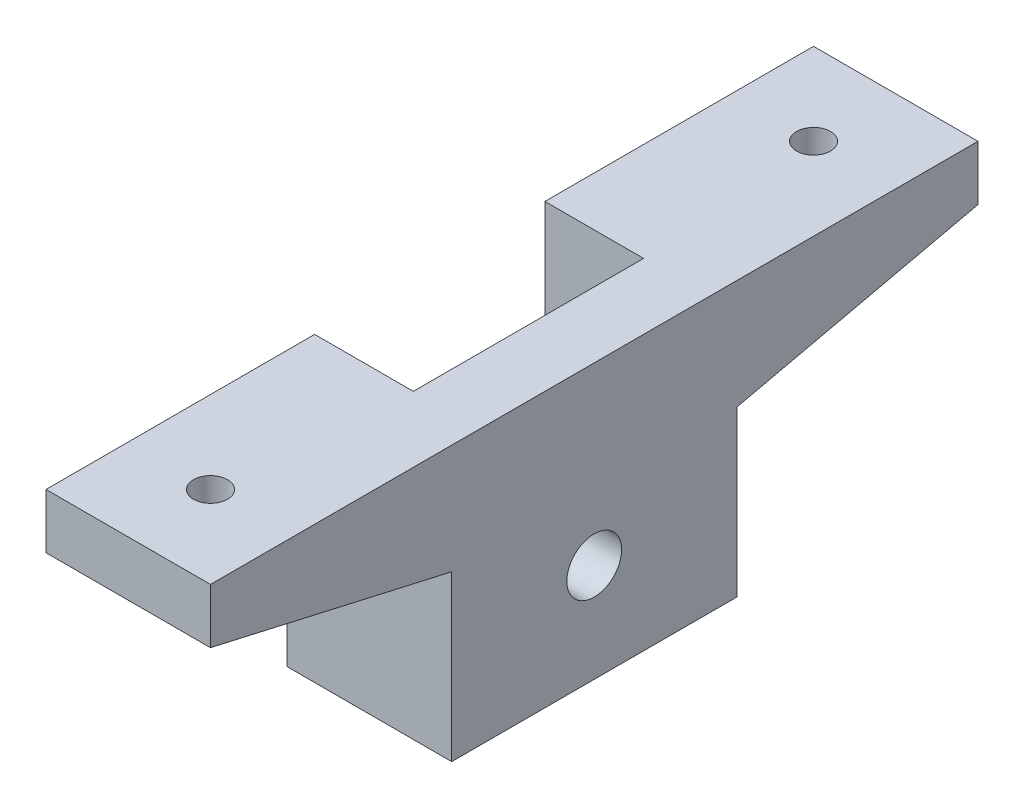
ISO-10303-21;
HEADER;
FILE_DESCRIPTION(('STEP AP214'),'2;1');
FILE_NAME('part.step','',(''),(''),'','','');
FILE_SCHEMA(('AUTOMOTIVE_DESIGN { 1 0 10303 214 1 1 1 1 }'));
ENDSEC;
DATA;
#1=APPLICATION_CONTEXT('core data for automotive mechanical design processes');
#2=APPLICATION_PROTOCOL_DEFINITION('international standard','automotive_design',2000,#1);
#3=PRODUCT_CONTEXT('',#1,'mechanical');
#4=PRODUCT('Part','Part','',(#3));
#5=PRODUCT_RELATED_PRODUCT_CATEGORY('part','',(#4));
#6=PRODUCT_DEFINITION_FORMATION('','',#4);
#7=PRODUCT_DEFINITION_CONTEXT('part definition',#1,'design');
#8=PRODUCT_DEFINITION('design','',#6,#7);
#9=PRODUCT_DEFINITION_SHAPE('','',#8);
#10=(LENGTH_UNIT() NAMED_UNIT(*) SI_UNIT(.MILLI.,.METRE.));
#11=(NAMED_UNIT(*) PLANE_ANGLE_UNIT() SI_UNIT($,.RADIAN.));
#12=(NAMED_UNIT(*) SI_UNIT($,.STERADIAN.) SOLID_ANGLE_UNIT());
#13=UNCERTAINTY_MEASURE_WITH_UNIT(LENGTH_MEASURE(1.E-05),#10,'distance_accuracy_value','');
#14=(GEOMETRIC_REPRESENTATION_CONTEXT(3) GLOBAL_UNCERTAINTY_ASSIGNED_CONTEXT((#13)) GLOBAL_UNIT_ASSIGNED_CONTEXT((#10,
#11,#12)) REPRESENTATION_CONTEXT('',''));
#15=CARTESIAN_POINT('',(0.,0.,0.));
#16=DIRECTION('',(0.,0.,1.));
#17=DIRECTION('',(1.,0.,0.));
#18=AXIS2_PLACEMENT_3D('',#15,#16,#17);
#19=CARTESIAN_POINT('',(0.,25.,70.));
#20=DIRECTION('',(1.,0.,0.));
#21=DIRECTION('',(0.,0.,-1.));
#22=AXIS2_PLACEMENT_3D('',#19,#20,#21);
#23=PLANE('',#22);
#24=DIRECTION('',(0.,0.,1.));
#25=VECTOR('',#24,1.);
#26=CARTESIAN_POINT('',(0.,0.,70.));
#27=LINE('',#26,#25);
#28=CARTESIAN_POINT('',(0.,0.,22.));
#29=VERTEX_POINT('',#28);
#30=CARTESIAN_POINT('',(0.,0.,24.5));
#31=VERTEX_POINT('',#30);
#32=EDGE_CURVE('E156',#29,#31,#27,.T.);
#33=ORIENTED_EDGE('',*,*,#32,.T.);
#34=DIRECTION('',(0.,1.,0.));
#35=VECTOR('',#34,1.);
#36=CARTESIAN_POINT('',(0.,0.,24.5));
#37=LINE('',#36,#35);
#38=CARTESIAN_POINT('',(0.,25.,24.5));
#39=VERTEX_POINT('',#38);
#40=EDGE_CURVE('E213',#31,#39,#37,.T.);
#41=ORIENTED_EDGE('',*,*,#40,.T.);
#42=DIRECTION('',(0.,0.,1.));
#43=VECTOR('',#42,1.);
#44=CARTESIAN_POINT('',(0.,25.,70.));
#45=LINE('',#44,#43);
#46=CARTESIAN_POINT('',(0.,25.,0.));
#47=VERTEX_POINT('',#46);
#48=EDGE_CURVE('E258',#47,#39,#45,.T.);
#49=ORIENTED_EDGE('',*,*,#48,.F.);
#50=DIRECTION('',(0.,-1.,0.));
#51=VECTOR('',#50,1.);
#52=CARTESIAN_POINT('',(0.,25.,0.));
#53=LINE('',#52,#51);
#54=CARTESIAN_POINT('',(0.,20.,0.));
#55=VERTEX_POINT('',#54);
#56=EDGE_CURVE('E173',#47,#55,#53,.T.);
#57=ORIENTED_EDGE('',*,*,#56,.T.);
#58=DIRECTION('',(0.,-0.221621103588968,0.97513285579146));
#59=VECTOR('',#58,1.);
#60=CARTESIAN_POINT('',(0.,5.11787819253439,65.4813359528487));
#61=LINE('',#60,#59);
#62=CARTESIAN_POINT('',(0.,15.,22.));
#63=VERTEX_POINT('',#62);
#64=EDGE_CURVE('E164',#55,#63,#61,.T.);
#65=ORIENTED_EDGE('',*,*,#64,.T.);
#66=DIRECTION('',(0.,-1.,0.));
#67=VECTOR('',#66,1.);
#68=CARTESIAN_POINT('',(0.,25.,22.));
#69=LINE('',#68,#67);
#70=EDGE_CURVE('E236',#63,#29,#69,.T.);
#71=ORIENTED_EDGE('',*,*,#70,.T.);
#72=EDGE_LOOP('',(#33,#41,#49,#57,#65,#71));
#73=FACE_BOUND('',#72,.T.);
#74=ADVANCED_FACE('F39',(#73),#23,.F.);
#75=CARTESIAN_POINT('',(0.,25.,45.5));
#76=VERTEX_POINT('',#75);
#77=CARTESIAN_POINT('',(0.,25.,70.));
#78=VERTEX_POINT('',#77);
#79=EDGE_CURVE('E147',#76,#78,#45,.T.);
#80=ORIENTED_EDGE('',*,*,#79,.F.);
#81=DIRECTION('',(0.,1.,0.));
#82=VECTOR('',#81,1.);
#83=CARTESIAN_POINT('',(0.,0.,45.5));
#84=LINE('',#83,#82);
#85=CARTESIAN_POINT('',(0.,0.,45.5));
#86=VERTEX_POINT('',#85);
#87=EDGE_CURVE('E133',#86,#76,#84,.T.);
#88=ORIENTED_EDGE('',*,*,#87,.F.);
#89=CARTESIAN_POINT('',(0.,0.,48.));
#90=VERTEX_POINT('',#89);
#91=EDGE_CURVE('E144',#86,#90,#27,.T.);
#92=ORIENTED_EDGE('',*,*,#91,.T.);
#93=DIRECTION('',(0.,1.,0.));
#94=VECTOR('',#93,1.);
#95=CARTESIAN_POINT('',(0.,25.,48.));
#96=LINE('',#95,#94);
#97=CARTESIAN_POINT('',(0.,15.,48.));
#98=VERTEX_POINT('',#97);
#99=EDGE_CURVE('E252',#90,#98,#96,.T.);
#100=ORIENTED_EDGE('',*,*,#99,.T.);
#101=DIRECTION('',(0.,0.221621103588968,0.97513285579146));
#102=VECTOR('',#101,1.);
#103=CARTESIAN_POINT('',(0.,20.24557956778,71.0805500982318));
#104=LINE('',#103,#102);
#105=CARTESIAN_POINT('',(0.,20.,70.));
#106=VERTEX_POINT('',#105);
#107=EDGE_CURVE('E157',#98,#106,#104,.T.);
#108=ORIENTED_EDGE('',*,*,#107,.T.);
#109=DIRECTION('',(0.,-1.,0.));
#110=VECTOR('',#109,1.);
#111=CARTESIAN_POINT('',(0.,25.,70.));
#112=LINE('',#111,#110);
#113=EDGE_CURVE('E185',#78,#106,#112,.T.);
#114=ORIENTED_EDGE('',*,*,#113,.F.);
#115=EDGE_LOOP('',(#80,#88,#92,#100,#108,#114));
#116=FACE_BOUND('',#115,.T.);
#117=ADVANCED_FACE('F41',(#116),#23,.F.);
#118=CARTESIAN_POINT('',(15.,25.,70.));
#119=DIRECTION('',(0.,0.,-1.));
#120=DIRECTION('',(-1.,0.,0.));
#121=AXIS2_PLACEMENT_3D('',#118,#119,#120);
#122=PLANE('',#121);
#123=ORIENTED_EDGE('',*,*,#113,.T.);
#124=DIRECTION('',(1.,0.,0.));
#125=VECTOR('',#124,1.);
#126=CARTESIAN_POINT('',(-25.,20.,70.));
#127=LINE('',#126,#125);
#128=CARTESIAN_POINT('',(15.,20.,70.));
#129=VERTEX_POINT('',#128);
#130=EDGE_CURVE('E232',#106,#129,#127,.T.);
#131=ORIENTED_EDGE('',*,*,#130,.T.);
#132=DIRECTION('',(0.,-1.,0.));
#133=VECTOR('',#132,1.);
#134=CARTESIAN_POINT('',(15.,25.,70.));
#135=LINE('',#134,#133);
#136=CARTESIAN_POINT('',(15.,25.,70.));
#137=VERTEX_POINT('',#136);
#138=EDGE_CURVE('E181',#137,#129,#135,.T.);
#139=ORIENTED_EDGE('',*,*,#138,.F.);
#140=DIRECTION('',(1.,0.,0.));
#141=VECTOR('',#140,1.);
#142=CARTESIAN_POINT('',(15.,25.,70.));
#143=LINE('',#142,#141);
#144=EDGE_CURVE('E262',#78,#137,#143,.T.);
#145=ORIENTED_EDGE('',*,*,#144,.F.);
#146=EDGE_LOOP('',(#123,#131,#139,#145));
#147=FACE_BOUND('',#146,.T.);
#148=ADVANCED_FACE('F318',(#147),#122,.F.);
#149=CARTESIAN_POINT('',(15.,25.,0.));
#150=DIRECTION('',(-1.,0.,0.));
#151=DIRECTION('',(0.,0.,1.));
#152=AXIS2_PLACEMENT_3D('',#149,#150,#151);
#153=PLANE('',#152);
#154=CARTESIAN_POINT('',(15.,9.,35.));
#155=DIRECTION('',(1.,0.,0.));
#156=DIRECTION('',(0.,0.,-1.));
#157=AXIS2_PLACEMENT_3D('',#154,#155,#156);
#158=CIRCLE('',#157,2.5);
#159=CARTESIAN_POINT('',(15.,9.,32.5));
#160=VERTEX_POINT('',#159);
#161=EDGE_CURVE('E293',#160,#160,#158,.T.);
#162=ORIENTED_EDGE('',*,*,#161,.F.);
#163=EDGE_LOOP('',(#162));
#164=FACE_BOUND('',#163,.T.);
#165=ORIENTED_EDGE('',*,*,#138,.T.);
#166=DIRECTION('',(0.,0.221621103588968,0.97513285579146));
#167=VECTOR('',#166,1.);
#168=CARTESIAN_POINT('',(15.,20.,70.));
#169=LINE('',#168,#167);
#170=CARTESIAN_POINT('',(15.,15.,48.));
#171=VERTEX_POINT('',#170);
#172=EDGE_CURVE('E227',#171,#129,#169,.T.);
#173=ORIENTED_EDGE('',*,*,#172,.F.);
#174=DIRECTION('',(0.,1.,0.));
#175=VECTOR('',#174,1.);
#176=CARTESIAN_POINT('',(15.,15.,48.));
#177=LINE('',#176,#175);
#178=CARTESIAN_POINT('',(15.,0.,48.));
#179=VERTEX_POINT('',#178);
#180=EDGE_CURVE('E223',#179,#171,#177,.T.);
#181=ORIENTED_EDGE('',*,*,#180,.F.);
#182=DIRECTION('',(0.,0.,-1.));
#183=VECTOR('',#182,1.);
#184=CARTESIAN_POINT('',(15.,0.,0.));
#185=LINE('',#184,#183);
#186=CARTESIAN_POINT('',(15.,0.,22.));
#187=VERTEX_POINT('',#186);
#188=EDGE_CURVE('E162',#179,#187,#185,.T.);
#189=ORIENTED_EDGE('',*,*,#188,.T.);
#190=DIRECTION('',(0.,-1.,0.));
#191=VECTOR('',#190,1.);
#192=CARTESIAN_POINT('',(15.,15.,22.));
#193=LINE('',#192,#191);
#194=CARTESIAN_POINT('',(15.,15.,22.));
#195=VERTEX_POINT('',#194);
#196=EDGE_CURVE('E65',#195,#187,#193,.T.);
#197=ORIENTED_EDGE('',*,*,#196,.F.);
#198=DIRECTION('',(0.,-0.221621103588968,0.97513285579146));
#199=VECTOR('',#198,1.);
#200=CARTESIAN_POINT('',(15.,20.,0.));
#201=LINE('',#200,#199);
#202=CARTESIAN_POINT('',(15.,20.,0.));
#203=VERTEX_POINT('',#202);
#204=EDGE_CURVE('E217',#203,#195,#201,.T.);
#205=ORIENTED_EDGE('',*,*,#204,.F.);
#206=DIRECTION('',(0.,-1.,0.));
#207=VECTOR('',#206,1.);
#208=CARTESIAN_POINT('',(15.,25.,0.));
#209=LINE('',#208,#207);
#210=CARTESIAN_POINT('',(15.,25.,0.));
#211=VERTEX_POINT('',#210);
#212=EDGE_CURVE('E177',#211,#203,#209,.T.);
#213=ORIENTED_EDGE('',*,*,#212,.F.);
#214=DIRECTION('',(0.,0.,-1.));
#215=VECTOR('',#214,1.);
#216=CARTESIAN_POINT('',(15.,25.,0.));
#217=LINE('',#216,#215);
#218=EDGE_CURVE('E264',#137,#211,#217,.T.);
#219=ORIENTED_EDGE('',*,*,#218,.F.);
#220=EDGE_LOOP('',(#165,#173,#181,#189,#197,#205,#213,#219));
#221=FACE_BOUND('',#220,.T.);
#222=ADVANCED_FACE('F322',(#164,#221),#153,.F.);
#223=CARTESIAN_POINT('',(0.,25.,0.));
#224=DIRECTION('',(0.,0.,1.));
#225=DIRECTION('',(1.,0.,0.));
#226=AXIS2_PLACEMENT_3D('',#223,#224,#225);
#227=PLANE('',#226);
#228=ORIENTED_EDGE('',*,*,#212,.T.);
#229=DIRECTION('',(1.,0.,0.));
#230=VECTOR('',#229,1.);
#231=CARTESIAN_POINT('',(-25.,20.,0.));
#232=LINE('',#231,#230);
#233=EDGE_CURVE('E244',#55,#203,#232,.T.);
#234=ORIENTED_EDGE('',*,*,#233,.F.);
#235=ORIENTED_EDGE('',*,*,#56,.F.);
#236=DIRECTION('',(-1.,0.,0.));
#237=VECTOR('',#236,1.);
#238=CARTESIAN_POINT('',(0.,25.,0.));
#239=LINE('',#238,#237);
#240=EDGE_CURVE('E168',#211,#47,#239,.T.);
#241=ORIENTED_EDGE('',*,*,#240,.F.);
#242=EDGE_LOOP('',(#228,#234,#235,#241));
#243=FACE_BOUND('',#242,.T.);
#244=ADVANCED_FACE('F277',(#243),#227,.F.);
#245=CARTESIAN_POINT('',(0.,25.,0.));
#246=DIRECTION('',(0.,-1.,0.));
#247=DIRECTION('',(0.,0.,-1.));
#248=AXIS2_PLACEMENT_3D('',#245,#246,#247);
#249=PLANE('',#248);
#250=CARTESIAN_POINT('',(7.5,25.,7.50000000000001));
#251=DIRECTION('',(0.,1.,0.));
#252=DIRECTION('',(0.,0.,1.));
#253=AXIS2_PLACEMENT_3D('',#250,#251,#252);
#254=CIRCLE('',#253,1.55);
#255=CARTESIAN_POINT('',(7.5,25.,9.05));
#256=VERTEX_POINT('',#255);
#257=EDGE_CURVE('E195',#256,#256,#254,.T.);
#258=ORIENTED_EDGE('',*,*,#257,.F.);
#259=EDGE_LOOP('',(#258));
#260=FACE_BOUND('',#259,.T.);
#261=CARTESIAN_POINT('',(7.50000000000001,25.,62.5));
#262=DIRECTION('',(0.,1.,0.));
#263=DIRECTION('',(0.,0.,1.));
#264=AXIS2_PLACEMENT_3D('',#261,#262,#263);
#265=CIRCLE('',#264,1.55);
#266=CARTESIAN_POINT('',(7.50000000000001,25.,64.05));
#267=VERTEX_POINT('',#266);
#268=EDGE_CURVE('E286',#267,#267,#265,.T.);
#269=ORIENTED_EDGE('',*,*,#268,.F.);
#270=EDGE_LOOP('',(#269));
#271=FACE_BOUND('',#270,.T.);
#272=ORIENTED_EDGE('',*,*,#48,.T.);
#273=DIRECTION('',(-1.,0.,0.));
#274=VECTOR('',#273,1.);
#275=CARTESIAN_POINT('',(0.,25.,24.5));
#276=LINE('',#275,#274);
#277=CARTESIAN_POINT('',(9.,25.,24.5));
#278=VERTEX_POINT('',#277);
#279=EDGE_CURVE('E139',#278,#39,#276,.T.);
#280=ORIENTED_EDGE('',*,*,#279,.F.);
#281=DIRECTION('',(0.,0.,-1.));
#282=VECTOR('',#281,1.);
#283=CARTESIAN_POINT('',(9.,25.,24.5));
#284=LINE('',#283,#282);
#285=CARTESIAN_POINT('',(9.,25.,45.5));
#286=VERTEX_POINT('',#285);
#287=EDGE_CURVE('E202',#286,#278,#284,.T.);
#288=ORIENTED_EDGE('',*,*,#287,.F.);
#289=DIRECTION('',(1.,0.,0.));
#290=VECTOR('',#289,1.);
#291=CARTESIAN_POINT('',(9.,25.,45.5));
#292=LINE('',#291,#290);
#293=EDGE_CURVE('E198',#76,#286,#292,.T.);
#294=ORIENTED_EDGE('',*,*,#293,.F.);
#295=ORIENTED_EDGE('',*,*,#79,.T.);
#296=ORIENTED_EDGE('',*,*,#144,.T.);
#297=ORIENTED_EDGE('',*,*,#218,.T.);
#298=ORIENTED_EDGE('',*,*,#240,.T.);
#299=EDGE_LOOP('',(#272,#280,#288,#294,#295,#296,#297,#298));
#300=FACE_BOUND('',#299,.T.);
#301=ADVANCED_FACE('F272',(#260,#271,#300),#249,.F.);
#302=CARTESIAN_POINT('',(0.,0.,0.));
#303=DIRECTION('',(0.,-1.,0.));
#304=DIRECTION('',(0.,0.,-1.));
#305=AXIS2_PLACEMENT_3D('',#302,#303,#304);
#306=PLANE('',#305);
#307=DIRECTION('',(-1.,0.,0.));
#308=VECTOR('',#307,1.);
#309=CARTESIAN_POINT('',(0.,0.,24.5));
#310=LINE('',#309,#308);
#311=CARTESIAN_POINT('',(9.,0.,24.5));
#312=VERTEX_POINT('',#311);
#313=EDGE_CURVE('E149',#312,#31,#310,.T.);
#314=ORIENTED_EDGE('',*,*,#313,.T.);
#315=ORIENTED_EDGE('',*,*,#32,.F.);
#316=DIRECTION('',(-1.,0.,0.));
#317=VECTOR('',#316,1.);
#318=CARTESIAN_POINT('',(0.,0.,22.));
#319=LINE('',#318,#317);
#320=EDGE_CURVE('E49',#187,#29,#319,.T.);
#321=ORIENTED_EDGE('',*,*,#320,.F.);
#322=ORIENTED_EDGE('',*,*,#188,.F.);
#323=DIRECTION('',(1.,0.,0.));
#324=VECTOR('',#323,1.);
#325=CARTESIAN_POINT('',(0.,0.,48.));
#326=LINE('',#325,#324);
#327=EDGE_CURVE('E11',#90,#179,#326,.T.);
#328=ORIENTED_EDGE('',*,*,#327,.F.);
#329=ORIENTED_EDGE('',*,*,#91,.F.);
#330=DIRECTION('',(1.,0.,0.));
#331=VECTOR('',#330,1.);
#332=CARTESIAN_POINT('',(9.,0.,45.5));
#333=LINE('',#332,#331);
#334=CARTESIAN_POINT('',(9.,0.,45.5));
#335=VERTEX_POINT('',#334);
#336=EDGE_CURVE('E129',#86,#335,#333,.T.);
#337=ORIENTED_EDGE('',*,*,#336,.T.);
#338=DIRECTION('',(0.,0.,-1.));
#339=VECTOR('',#338,1.);
#340=CARTESIAN_POINT('',(9.,0.,24.5));
#341=LINE('',#340,#339);
#342=EDGE_CURVE('E57',#335,#312,#341,.T.);
#343=ORIENTED_EDGE('',*,*,#342,.T.);
#344=EDGE_LOOP('',(#314,#315,#321,#322,#328,#329,#337,#343));
#345=FACE_BOUND('',#344,.T.);
#346=ADVANCED_FACE('F153',(#345),#306,.T.);
#347=CARTESIAN_POINT('',(-25.,20.,0.));
#348=DIRECTION('',(0.,0.97513285579146,0.221621103588968));
#349=DIRECTION('',(0.,-0.221621103588968,0.97513285579146));
#350=AXIS2_PLACEMENT_3D('',#347,#348,#349);
#351=PLANE('',#350);
#352=CARTESIAN_POINT('',(7.5,18.2954545454546,7.50000000000001));
#353=DIRECTION('',(0.,0.97513285579146,0.221621103588968));
#354=DIRECTION('',(0.,0.221621103588968,-0.97513285579146));
#355=AXIS2_PLACEMENT_3D('',#352,#353,#354);
#356=ELLIPSE('',#355,1.58952699705924,1.55);
#357=CARTESIAN_POINT('',(7.5,18.6477272727273,5.95000000000001));
#358=VERTEX_POINT('',#357);
#359=EDGE_CURVE('E194',#358,#358,#356,.T.);
#360=ORIENTED_EDGE('',*,*,#359,.T.);
#361=EDGE_LOOP('',(#360));
#362=FACE_BOUND('',#361,.T.);
#363=ORIENTED_EDGE('',*,*,#233,.T.);
#364=ORIENTED_EDGE('',*,*,#204,.T.);
#365=DIRECTION('',(1.,0.,0.));
#366=VECTOR('',#365,1.);
#367=CARTESIAN_POINT('',(-25.,15.,22.));
#368=LINE('',#367,#366);
#369=EDGE_CURVE('E228',#63,#195,#368,.T.);
#370=ORIENTED_EDGE('',*,*,#369,.F.);
#371=ORIENTED_EDGE('',*,*,#64,.F.);
#372=EDGE_LOOP('',(#363,#364,#370,#371));
#373=FACE_BOUND('',#372,.T.);
#374=ADVANCED_FACE('F334',(#362,#373),#351,.F.);
#375=CARTESIAN_POINT('',(-25.,15.,22.));
#376=DIRECTION('',(0.,0.,1.));
#377=DIRECTION('',(0.,-1.,0.));
#378=AXIS2_PLACEMENT_3D('',#375,#376,#377);
#379=PLANE('',#378);
#380=ORIENTED_EDGE('',*,*,#369,.T.);
#381=ORIENTED_EDGE('',*,*,#196,.T.);
#382=ORIENTED_EDGE('',*,*,#320,.T.);
#383=ORIENTED_EDGE('',*,*,#70,.F.);
#384=EDGE_LOOP('',(#380,#381,#382,#383));
#385=FACE_BOUND('',#384,.T.);
#386=ADVANCED_FACE('F340',(#385),#379,.F.);
#387=CARTESIAN_POINT('',(-25.,20.,70.));
#388=DIRECTION('',(0.,0.97513285579146,-0.221621103588968));
#389=DIRECTION('',(0.,0.221621103588968,0.97513285579146));
#390=AXIS2_PLACEMENT_3D('',#387,#388,#389);
#391=PLANE('',#390);
#392=CARTESIAN_POINT('',(7.50000000000001,18.2954545454545,62.5));
#393=DIRECTION('',(0.,0.97513285579146,-0.221621103588968));
#394=DIRECTION('',(0.,0.221621103588968,0.97513285579146));
#395=AXIS2_PLACEMENT_3D('',#392,#393,#394);
#396=ELLIPSE('',#395,1.58952699705924,1.55);
#397=CARTESIAN_POINT('',(7.50000000000001,18.6477272727273,64.05));
#398=VERTEX_POINT('',#397);
#399=EDGE_CURVE('E191',#398,#398,#396,.T.);
#400=ORIENTED_EDGE('',*,*,#399,.T.);
#401=EDGE_LOOP('',(#400));
#402=FACE_BOUND('',#401,.T.);
#403=DIRECTION('',(1.,0.,0.));
#404=VECTOR('',#403,1.);
#405=CARTESIAN_POINT('',(-25.,15.,48.));
#406=LINE('',#405,#404);
#407=EDGE_CURVE('E231',#98,#171,#406,.T.);
#408=ORIENTED_EDGE('',*,*,#407,.T.);
#409=ORIENTED_EDGE('',*,*,#172,.T.);
#410=ORIENTED_EDGE('',*,*,#130,.F.);
#411=ORIENTED_EDGE('',*,*,#107,.F.);
#412=EDGE_LOOP('',(#408,#409,#410,#411));
#413=FACE_BOUND('',#412,.T.);
#414=ADVANCED_FACE('F343',(#402,#413),#391,.F.);
#415=CARTESIAN_POINT('',(-25.,15.,48.));
#416=DIRECTION('',(0.,0.,-1.));
#417=DIRECTION('',(-1.,0.,0.));
#418=AXIS2_PLACEMENT_3D('',#415,#416,#417);
#419=PLANE('',#418);
#420=ORIENTED_EDGE('',*,*,#327,.T.);
#421=ORIENTED_EDGE('',*,*,#180,.T.);
#422=ORIENTED_EDGE('',*,*,#407,.F.);
#423=ORIENTED_EDGE('',*,*,#99,.F.);
#424=EDGE_LOOP('',(#420,#421,#422,#423));
#425=FACE_BOUND('',#424,.T.);
#426=ADVANCED_FACE('F344',(#425),#419,.F.);
#427=CARTESIAN_POINT('',(0.,0.,24.5));
#428=DIRECTION('',(0.,0.,-1.));
#429=DIRECTION('',(-1.,0.,0.));
#430=AXIS2_PLACEMENT_3D('',#427,#428,#429);
#431=PLANE('',#430);
#432=ORIENTED_EDGE('',*,*,#279,.T.);
#433=ORIENTED_EDGE('',*,*,#40,.F.);
#434=ORIENTED_EDGE('',*,*,#313,.F.);
#435=DIRECTION('',(0.,1.,0.));
#436=VECTOR('',#435,1.);
#437=CARTESIAN_POINT('',(9.,0.,24.5));
#438=LINE('',#437,#436);
#439=EDGE_CURVE('E218',#312,#278,#438,.T.);
#440=ORIENTED_EDGE('',*,*,#439,.T.);
#441=EDGE_LOOP('',(#432,#433,#434,#440));
#442=FACE_BOUND('',#441,.T.);
#443=ADVANCED_FACE('F282',(#442),#431,.F.);
#444=CARTESIAN_POINT('',(9.,0.,24.5));
#445=DIRECTION('',(1.,0.,0.));
#446=DIRECTION('',(0.,0.,-1.));
#447=AXIS2_PLACEMENT_3D('',#444,#445,#446);
#448=PLANE('',#447);
#449=CARTESIAN_POINT('',(9.,9.,35.));
#450=DIRECTION('',(1.,0.,0.));
#451=DIRECTION('',(0.,0.,-1.));
#452=AXIS2_PLACEMENT_3D('',#449,#450,#451);
#453=CIRCLE('',#452,2.5);
#454=CARTESIAN_POINT('',(9.,9.,32.5));
#455=VERTEX_POINT('',#454);
#456=EDGE_CURVE('E43',#455,#455,#453,.T.);
#457=ORIENTED_EDGE('',*,*,#456,.T.);
#458=EDGE_LOOP('',(#457));
#459=FACE_BOUND('',#458,.T.);
#460=ORIENTED_EDGE('',*,*,#287,.T.);
#461=ORIENTED_EDGE('',*,*,#439,.F.);
#462=ORIENTED_EDGE('',*,*,#342,.F.);
#463=DIRECTION('',(0.,1.,0.));
#464=VECTOR('',#463,1.);
#465=CARTESIAN_POINT('',(9.,0.,45.5));
#466=LINE('',#465,#464);
#467=EDGE_CURVE('E135',#335,#286,#466,.T.);
#468=ORIENTED_EDGE('',*,*,#467,.T.);
#469=EDGE_LOOP('',(#460,#461,#462,#468));
#470=FACE_BOUND('',#469,.T.);
#471=ADVANCED_FACE('F302',(#459,#470),#448,.F.);
#472=CARTESIAN_POINT('',(9.,0.,45.5));
#473=DIRECTION('',(0.,0.,1.));
#474=DIRECTION('',(1.,0.,0.));
#475=AXIS2_PLACEMENT_3D('',#472,#473,#474);
#476=PLANE('',#475);
#477=ORIENTED_EDGE('',*,*,#293,.T.);
#478=ORIENTED_EDGE('',*,*,#467,.F.);
#479=ORIENTED_EDGE('',*,*,#336,.F.);
#480=ORIENTED_EDGE('',*,*,#87,.T.);
#481=EDGE_LOOP('',(#477,#478,#479,#480));
#482=FACE_BOUND('',#481,.T.);
#483=ADVANCED_FACE('F132',(#482),#476,.F.);
#484=CARTESIAN_POINT('',(7.50000000000001,0.,62.5));
#485=DIRECTION('',(0.,1.,0.));
#486=DIRECTION('',(0.,0.,1.));
#487=AXIS2_PLACEMENT_3D('',#484,#485,#486);
#488=CYLINDRICAL_SURFACE('',#487,1.55);
#489=ORIENTED_EDGE('',*,*,#268,.T.);
#490=EDGE_LOOP('',(#489));
#491=FACE_BOUND('',#490,.T.);
#492=ORIENTED_EDGE('',*,*,#399,.F.);
#493=EDGE_LOOP('',(#492));
#494=FACE_BOUND('',#493,.T.);
#495=ADVANCED_FACE('F311',(#491,#494),#488,.F.);
#496=CARTESIAN_POINT('',(7.5,0.,7.50000000000001));
#497=DIRECTION('',(0.,1.,0.));
#498=DIRECTION('',(0.,0.,1.));
#499=AXIS2_PLACEMENT_3D('',#496,#497,#498);
#500=CYLINDRICAL_SURFACE('',#499,1.55);
#501=ORIENTED_EDGE('',*,*,#257,.T.);
#502=EDGE_LOOP('',(#501));
#503=FACE_BOUND('',#502,.T.);
#504=ORIENTED_EDGE('',*,*,#359,.F.);
#505=EDGE_LOOP('',(#504));
#506=FACE_BOUND('',#505,.T.);
#507=ADVANCED_FACE('F306',(#503,#506),#500,.F.);
#508=CARTESIAN_POINT('',(0.,9.,35.));
#509=DIRECTION('',(1.,0.,0.));
#510=DIRECTION('',(0.,0.,-1.));
#511=AXIS2_PLACEMENT_3D('',#508,#509,#510);
#512=CYLINDRICAL_SURFACE('',#511,2.5);
#513=ORIENTED_EDGE('',*,*,#161,.T.);
#514=EDGE_LOOP('',(#513));
#515=FACE_BOUND('',#514,.T.);
#516=ORIENTED_EDGE('',*,*,#456,.F.);
#517=EDGE_LOOP('',(#516));
#518=FACE_BOUND('',#517,.T.);
#519=ADVANCED_FACE('F304',(#515,#518),#512,.F.);
#520=CLOSED_SHELL('',(#74,#117,#148,#222,#244,#301,#346,#374,#386,#414,#426,#443,#471,#483,#495,
#507,#519));
#521=MANIFOLD_SOLID_BREP('B2',#520);
#522=ADVANCED_BREP_SHAPE_REPRESENTATION('',(#18,#521),#14);
#523=SHAPE_DEFINITION_REPRESENTATION(#9,#522);
ENDSEC;
END-ISO-10303-21;
